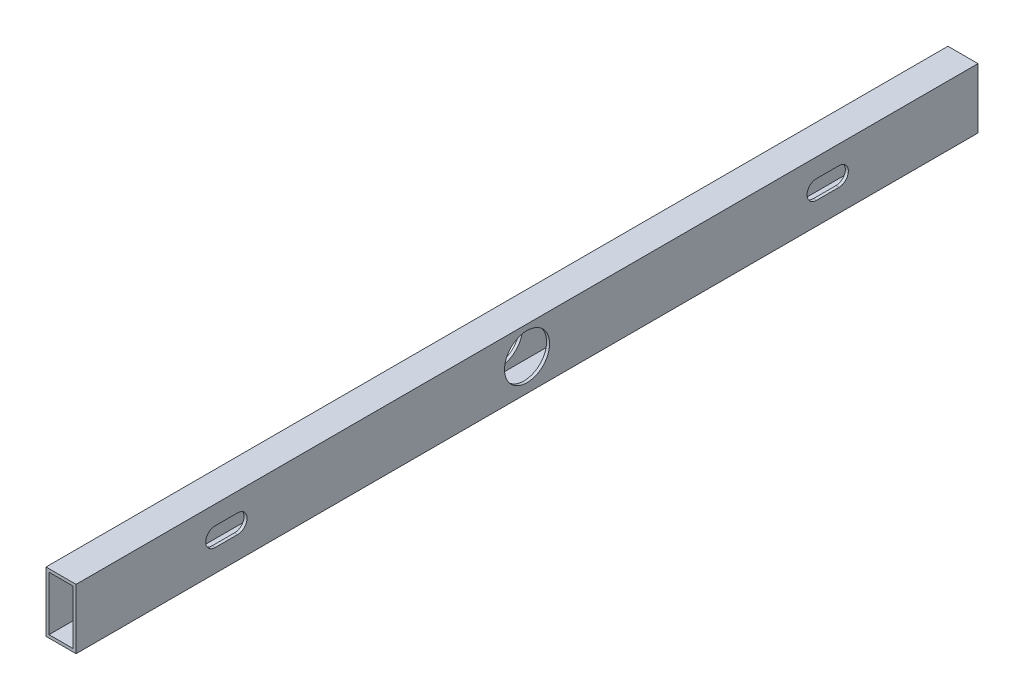
ISO-10303-21;
HEADER;
FILE_DESCRIPTION(('STEP AP214'),'2;1');
FILE_NAME('part.step','',(''),(''),'','','');
FILE_SCHEMA(('AUTOMOTIVE_DESIGN { 1 0 10303 214 1 1 1 1 }'));
ENDSEC;
DATA;
#1=APPLICATION_CONTEXT('core data for automotive mechanical design processes');
#2=APPLICATION_PROTOCOL_DEFINITION('international standard','automotive_design',2000,#1);
#3=PRODUCT_CONTEXT('',#1,'mechanical');
#4=PRODUCT('Part','Part','',(#3));
#5=PRODUCT_RELATED_PRODUCT_CATEGORY('part','',(#4));
#6=PRODUCT_DEFINITION_FORMATION('','',#4);
#7=PRODUCT_DEFINITION_CONTEXT('part definition',#1,'design');
#8=PRODUCT_DEFINITION('design','',#6,#7);
#9=PRODUCT_DEFINITION_SHAPE('','',#8);
#10=(LENGTH_UNIT() NAMED_UNIT(*) SI_UNIT(.MILLI.,.METRE.));
#11=(NAMED_UNIT(*) PLANE_ANGLE_UNIT() SI_UNIT($,.RADIAN.));
#12=(NAMED_UNIT(*) SI_UNIT($,.STERADIAN.) SOLID_ANGLE_UNIT());
#13=UNCERTAINTY_MEASURE_WITH_UNIT(LENGTH_MEASURE(1.E-05),#10,'distance_accuracy_value','');
#14=(GEOMETRIC_REPRESENTATION_CONTEXT(3) GLOBAL_UNCERTAINTY_ASSIGNED_CONTEXT((#13)) GLOBAL_UNIT_ASSIGNED_CONTEXT((#10,
#11,#12)) REPRESENTATION_CONTEXT('',''));
#15=CARTESIAN_POINT('',(0.,0.,0.));
#16=DIRECTION('',(0.,0.,1.));
#17=DIRECTION('',(1.,0.,0.));
#18=AXIS2_PLACEMENT_3D('',#15,#16,#17);
#19=CARTESIAN_POINT('',(0.,0.,381.));
#20=DIRECTION('',(0.,0.,1.));
#21=DIRECTION('',(1.,0.,0.));
#22=AXIS2_PLACEMENT_3D('',#19,#20,#21);
#23=PLANE('',#22);
#24=DIRECTION('',(0.,1.,0.));
#25=VECTOR('',#24,1.);
#26=CARTESIAN_POINT('',(12.7,-25.4,381.));
#27=LINE('',#26,#25);
#28=CARTESIAN_POINT('',(12.7,-25.4,381.));
#29=VERTEX_POINT('',#28);
#30=CARTESIAN_POINT('',(12.7,25.4,381.));
#31=VERTEX_POINT('',#30);
#32=EDGE_CURVE('E368',#29,#31,#27,.T.);
#33=ORIENTED_EDGE('',*,*,#32,.T.);
#34=DIRECTION('',(-1.,0.,0.));
#35=VECTOR('',#34,1.);
#36=CARTESIAN_POINT('',(-12.7,25.4,381.));
#37=LINE('',#36,#35);
#38=CARTESIAN_POINT('',(-12.7,25.4,381.));
#39=VERTEX_POINT('',#38);
#40=EDGE_CURVE('E371',#31,#39,#37,.T.);
#41=ORIENTED_EDGE('',*,*,#40,.T.);
#42=DIRECTION('',(0.,-1.,0.));
#43=VECTOR('',#42,1.);
#44=CARTESIAN_POINT('',(-12.7,-25.4,381.));
#45=LINE('',#44,#43);
#46=CARTESIAN_POINT('',(-12.7,-25.4,381.));
#47=VERTEX_POINT('',#46);
#48=EDGE_CURVE('E374',#39,#47,#45,.T.);
#49=ORIENTED_EDGE('',*,*,#48,.T.);
#50=DIRECTION('',(1.,0.,0.));
#51=VECTOR('',#50,1.);
#52=CARTESIAN_POINT('',(-12.7,-25.4,381.));
#53=LINE('',#52,#51);
#54=EDGE_CURVE('E376',#47,#29,#53,.T.);
#55=ORIENTED_EDGE('',*,*,#54,.T.);
#56=EDGE_LOOP('',(#33,#41,#49,#55));
#57=FACE_BOUND('',#56,.T.);
#58=DIRECTION('',(-1.,0.,0.));
#59=VECTOR('',#58,1.);
#60=CARTESIAN_POINT('',(0.,22.86,381.));
#61=LINE('',#60,#59);
#62=CARTESIAN_POINT('',(10.16,22.86,381.));
#63=VERTEX_POINT('',#62);
#64=CARTESIAN_POINT('',(-10.16,22.86,381.));
#65=VERTEX_POINT('',#64);
#66=EDGE_CURVE('E339',#63,#65,#61,.T.);
#67=ORIENTED_EDGE('',*,*,#66,.F.);
#68=DIRECTION('',(0.,1.,0.));
#69=VECTOR('',#68,1.);
#70=CARTESIAN_POINT('',(10.16,0.,381.));
#71=LINE('',#70,#69);
#72=CARTESIAN_POINT('',(10.16,-22.86,381.));
#73=VERTEX_POINT('',#72);
#74=EDGE_CURVE('E337',#73,#63,#71,.T.);
#75=ORIENTED_EDGE('',*,*,#74,.F.);
#76=DIRECTION('',(1.,0.,0.));
#77=VECTOR('',#76,1.);
#78=CARTESIAN_POINT('',(0.,-22.86,381.));
#79=LINE('',#78,#77);
#80=CARTESIAN_POINT('',(-10.16,-22.86,381.));
#81=VERTEX_POINT('',#80);
#82=EDGE_CURVE('E345',#81,#73,#79,.T.);
#83=ORIENTED_EDGE('',*,*,#82,.F.);
#84=DIRECTION('',(0.,-1.,0.));
#85=VECTOR('',#84,1.);
#86=CARTESIAN_POINT('',(-10.16,0.,381.));
#87=LINE('',#86,#85);
#88=EDGE_CURVE('E342',#65,#81,#87,.T.);
#89=ORIENTED_EDGE('',*,*,#88,.F.);
#90=EDGE_LOOP('',(#67,#75,#83,#89));
#91=FACE_BOUND('',#90,.T.);
#92=ADVANCED_FACE('F58',(#57,#91),#23,.T.);
#93=CARTESIAN_POINT('',(0.,0.,-381.));
#94=DIRECTION('',(0.,0.,1.));
#95=DIRECTION('',(1.,0.,0.));
#96=AXIS2_PLACEMENT_3D('',#93,#94,#95);
#97=PLANE('',#96);
#98=DIRECTION('',(0.,1.,0.));
#99=VECTOR('',#98,1.);
#100=CARTESIAN_POINT('',(12.7,-25.4,-381.));
#101=LINE('',#100,#99);
#102=CARTESIAN_POINT('',(12.7,-25.4,-381.));
#103=VERTEX_POINT('',#102);
#104=CARTESIAN_POINT('',(12.7,25.4,-381.));
#105=VERTEX_POINT('',#104);
#106=EDGE_CURVE('E367',#103,#105,#101,.T.);
#107=ORIENTED_EDGE('',*,*,#106,.F.);
#108=DIRECTION('',(1.,0.,0.));
#109=VECTOR('',#108,1.);
#110=CARTESIAN_POINT('',(-12.7,-25.4,-381.));
#111=LINE('',#110,#109);
#112=CARTESIAN_POINT('',(-12.7,-25.4,-381.));
#113=VERTEX_POINT('',#112);
#114=EDGE_CURVE('E372',#113,#103,#111,.T.);
#115=ORIENTED_EDGE('',*,*,#114,.F.);
#116=DIRECTION('',(0.,-1.,0.));
#117=VECTOR('',#116,1.);
#118=CARTESIAN_POINT('',(-12.7,-25.4,-381.));
#119=LINE('',#118,#117);
#120=CARTESIAN_POINT('',(-12.7,25.4,-381.));
#121=VERTEX_POINT('',#120);
#122=EDGE_CURVE('E383',#121,#113,#119,.T.);
#123=ORIENTED_EDGE('',*,*,#122,.F.);
#124=DIRECTION('',(-1.,0.,0.));
#125=VECTOR('',#124,1.);
#126=CARTESIAN_POINT('',(-12.7,25.4,-381.));
#127=LINE('',#126,#125);
#128=EDGE_CURVE('E381',#105,#121,#127,.T.);
#129=ORIENTED_EDGE('',*,*,#128,.F.);
#130=EDGE_LOOP('',(#107,#115,#123,#129));
#131=FACE_BOUND('',#130,.T.);
#132=DIRECTION('',(0.,1.,0.));
#133=VECTOR('',#132,1.);
#134=CARTESIAN_POINT('',(10.16,0.,-381.));
#135=LINE('',#134,#133);
#136=CARTESIAN_POINT('',(10.16,-22.86,-381.));
#137=VERTEX_POINT('',#136);
#138=CARTESIAN_POINT('',(10.16,22.86,-381.));
#139=VERTEX_POINT('',#138);
#140=EDGE_CURVE('E336',#137,#139,#135,.T.);
#141=ORIENTED_EDGE('',*,*,#140,.T.);
#142=DIRECTION('',(-1.,0.,0.));
#143=VECTOR('',#142,1.);
#144=CARTESIAN_POINT('',(0.,22.86,-381.));
#145=LINE('',#144,#143);
#146=CARTESIAN_POINT('',(-10.16,22.86,-381.));
#147=VERTEX_POINT('',#146);
#148=EDGE_CURVE('E350',#139,#147,#145,.T.);
#149=ORIENTED_EDGE('',*,*,#148,.T.);
#150=DIRECTION('',(0.,-1.,0.));
#151=VECTOR('',#150,1.);
#152=CARTESIAN_POINT('',(-10.16,0.,-381.));
#153=LINE('',#152,#151);
#154=CARTESIAN_POINT('',(-10.16,-22.86,-381.));
#155=VERTEX_POINT('',#154);
#156=EDGE_CURVE('E353',#147,#155,#153,.T.);
#157=ORIENTED_EDGE('',*,*,#156,.T.);
#158=DIRECTION('',(1.,0.,0.));
#159=VECTOR('',#158,1.);
#160=CARTESIAN_POINT('',(0.,-22.86,-381.));
#161=LINE('',#160,#159);
#162=EDGE_CURVE('E340',#155,#137,#161,.T.);
#163=ORIENTED_EDGE('',*,*,#162,.T.);
#164=EDGE_LOOP('',(#141,#149,#157,#163));
#165=FACE_BOUND('',#164,.T.);
#166=ADVANCED_FACE('F442',(#131,#165),#97,.F.);
#167=CARTESIAN_POINT('',(12.7,-25.4,381.));
#168=DIRECTION('',(-1.,0.,0.));
#169=DIRECTION('',(0.,0.,1.));
#170=AXIS2_PLACEMENT_3D('',#167,#168,#169);
#171=PLANE('',#170);
#172=DIRECTION('',(0.,0.,1.));
#173=VECTOR('',#172,1.);
#174=CARTESIAN_POINT('',(12.7,9.46150000000008,244.475));
#175=LINE('',#174,#173);
#176=CARTESIAN_POINT('',(12.7,9.46150000000009,244.475));
#177=VERTEX_POINT('',#176);
#178=CARTESIAN_POINT('',(12.7,9.46150000000008,263.525));
#179=VERTEX_POINT('',#178);
#180=EDGE_CURVE('E288',#177,#179,#175,.T.);
#181=ORIENTED_EDGE('',*,*,#180,.F.);
#182=CARTESIAN_POINT('',(12.7,1.52399999999994,244.475));
#183=DIRECTION('',(1.,0.,0.));
#184=DIRECTION('',(0.,0.,1.));
#185=AXIS2_PLACEMENT_3D('',#182,#183,#184);
#186=CIRCLE('',#185,7.93750000000007);
#187=CARTESIAN_POINT('',(12.7,-6.41350000000006,244.475));
#188=VERTEX_POINT('',#187);
#189=EDGE_CURVE('E73',#188,#177,#186,.T.);
#190=ORIENTED_EDGE('',*,*,#189,.F.);
#191=DIRECTION('',(0.,0.,-1.));
#192=VECTOR('',#191,1.);
#193=CARTESIAN_POINT('',(12.7,-6.41350000000006,244.475));
#194=LINE('',#193,#192);
#195=CARTESIAN_POINT('',(12.7,-6.41350000000013,263.525));
#196=VERTEX_POINT('',#195);
#197=EDGE_CURVE('E277',#196,#188,#194,.T.);
#198=ORIENTED_EDGE('',*,*,#197,.F.);
#199=CARTESIAN_POINT('',(12.7,1.52399999999994,263.525));
#200=DIRECTION('',(1.,0.,0.));
#201=DIRECTION('',(0.,0.,1.));
#202=AXIS2_PLACEMENT_3D('',#199,#200,#201);
#203=CIRCLE('',#202,7.93750000000007);
#204=EDGE_CURVE('E291',#179,#196,#203,.T.);
#205=ORIENTED_EDGE('',*,*,#204,.F.);
#206=EDGE_LOOP('',(#181,#190,#198,#205));
#207=FACE_BOUND('',#206,.T.);
#208=DIRECTION('',(0.,0.,-1.));
#209=VECTOR('',#208,1.);
#210=CARTESIAN_POINT('',(12.7,-6.4135,-244.475));
#211=LINE('',#210,#209);
#212=CARTESIAN_POINT('',(12.7,-6.4135,-244.475));
#213=VERTEX_POINT('',#212);
#214=CARTESIAN_POINT('',(12.7,-6.41350000000006,-263.525));
#215=VERTEX_POINT('',#214);
#216=EDGE_CURVE('E258',#213,#215,#211,.T.);
#217=ORIENTED_EDGE('',*,*,#216,.F.);
#218=CARTESIAN_POINT('',(12.7,1.524,-244.475));
#219=DIRECTION('',(1.,0.,0.));
#220=DIRECTION('',(0.,0.,-1.));
#221=AXIS2_PLACEMENT_3D('',#218,#219,#220);
#222=CIRCLE('',#221,7.93750000000007);
#223=CARTESIAN_POINT('',(12.7,9.46150000000014,-244.475));
#224=VERTEX_POINT('',#223);
#225=EDGE_CURVE('E81',#224,#213,#222,.T.);
#226=ORIENTED_EDGE('',*,*,#225,.F.);
#227=DIRECTION('',(0.,0.,1.));
#228=VECTOR('',#227,1.);
#229=CARTESIAN_POINT('',(12.7,9.46150000000014,-244.475));
#230=LINE('',#229,#228);
#231=CARTESIAN_POINT('',(12.7,9.46150000000015,-263.525));
#232=VERTEX_POINT('',#231);
#233=EDGE_CURVE('E249',#232,#224,#230,.T.);
#234=ORIENTED_EDGE('',*,*,#233,.F.);
#235=CARTESIAN_POINT('',(12.7,1.52400000000001,-263.525));
#236=DIRECTION('',(1.,0.,0.));
#237=DIRECTION('',(0.,0.,-1.));
#238=AXIS2_PLACEMENT_3D('',#235,#236,#237);
#239=CIRCLE('',#238,7.93750000000007);
#240=EDGE_CURVE('E252',#215,#232,#239,.T.);
#241=ORIENTED_EDGE('',*,*,#240,.F.);
#242=EDGE_LOOP('',(#217,#226,#234,#241));
#243=FACE_BOUND('',#242,.T.);
#244=CARTESIAN_POINT('',(12.7,1.524,0.));
#245=DIRECTION('',(1.,0.,0.));
#246=DIRECTION('',(0.,0.,-1.));
#247=AXIS2_PLACEMENT_3D('',#244,#245,#246);
#248=CIRCLE('',#247,19.05);
#249=CARTESIAN_POINT('',(12.7,1.524,-19.05));
#250=VERTEX_POINT('',#249);
#251=EDGE_CURVE('E266',#250,#250,#248,.T.);
#252=ORIENTED_EDGE('',*,*,#251,.F.);
#253=EDGE_LOOP('',(#252));
#254=FACE_BOUND('',#253,.T.);
#255=ORIENTED_EDGE('',*,*,#106,.T.);
#256=DIRECTION('',(0.,0.,-1.));
#257=VECTOR('',#256,1.);
#258=CARTESIAN_POINT('',(12.7,25.4,381.));
#259=LINE('',#258,#257);
#260=EDGE_CURVE('E394',#31,#105,#259,.T.);
#261=ORIENTED_EDGE('',*,*,#260,.F.);
#262=ORIENTED_EDGE('',*,*,#32,.F.);
#263=DIRECTION('',(0.,0.,-1.));
#264=VECTOR('',#263,1.);
#265=CARTESIAN_POINT('',(12.7,-25.4,381.));
#266=LINE('',#265,#264);
#267=EDGE_CURVE('E378',#29,#103,#266,.T.);
#268=ORIENTED_EDGE('',*,*,#267,.T.);
#269=EDGE_LOOP('',(#255,#261,#262,#268));
#270=FACE_BOUND('',#269,.T.);
#271=ADVANCED_FACE('F60',(#207,#243,#254,#270),#171,.F.);
#272=CARTESIAN_POINT('',(-12.7,25.4,381.));
#273=DIRECTION('',(0.,-1.,0.));
#274=DIRECTION('',(0.,0.,-1.));
#275=AXIS2_PLACEMENT_3D('',#272,#273,#274);
#276=PLANE('',#275);
#277=ORIENTED_EDGE('',*,*,#128,.T.);
#278=DIRECTION('',(0.,0.,-1.));
#279=VECTOR('',#278,1.);
#280=CARTESIAN_POINT('',(-12.7,25.4,381.));
#281=LINE('',#280,#279);
#282=EDGE_CURVE('E391',#39,#121,#281,.T.);
#283=ORIENTED_EDGE('',*,*,#282,.F.);
#284=ORIENTED_EDGE('',*,*,#40,.F.);
#285=ORIENTED_EDGE('',*,*,#260,.T.);
#286=EDGE_LOOP('',(#277,#283,#284,#285));
#287=FACE_BOUND('',#286,.T.);
#288=ADVANCED_FACE('F431',(#287),#276,.F.);
#289=CARTESIAN_POINT('',(-12.7,-25.4,381.));
#290=DIRECTION('',(1.,0.,0.));
#291=DIRECTION('',(0.,0.,-1.));
#292=AXIS2_PLACEMENT_3D('',#289,#290,#291);
#293=PLANE('',#292);
#294=DIRECTION('',(0.,0.,-1.));
#295=VECTOR('',#294,1.);
#296=CARTESIAN_POINT('',(-12.7,-6.41350000000006,244.475));
#297=LINE('',#296,#295);
#298=CARTESIAN_POINT('',(-12.7,-6.41350000000013,263.525));
#299=VERTEX_POINT('',#298);
#300=CARTESIAN_POINT('',(-12.7,-6.41350000000006,244.475));
#301=VERTEX_POINT('',#300);
#302=EDGE_CURVE('E283',#299,#301,#297,.T.);
#303=ORIENTED_EDGE('',*,*,#302,.T.);
#304=CARTESIAN_POINT('',(-12.7,1.52399999999994,244.475));
#305=DIRECTION('',(1.,0.,0.));
#306=DIRECTION('',(0.,0.,1.));
#307=AXIS2_PLACEMENT_3D('',#304,#305,#306);
#308=CIRCLE('',#307,7.93750000000007);
#309=CARTESIAN_POINT('',(-12.7,9.46150000000008,244.475));
#310=VERTEX_POINT('',#309);
#311=EDGE_CURVE('E273',#301,#310,#308,.T.);
#312=ORIENTED_EDGE('',*,*,#311,.T.);
#313=DIRECTION('',(0.,0.,1.));
#314=VECTOR('',#313,1.);
#315=CARTESIAN_POINT('',(-12.7,9.46150000000008,244.475));
#316=LINE('',#315,#314);
#317=CARTESIAN_POINT('',(-12.7,9.46150000000009,263.525));
#318=VERTEX_POINT('',#317);
#319=EDGE_CURVE('E276',#310,#318,#316,.T.);
#320=ORIENTED_EDGE('',*,*,#319,.T.);
#321=CARTESIAN_POINT('',(-12.7,1.52399999999994,263.525));
#322=DIRECTION('',(1.,0.,0.));
#323=DIRECTION('',(0.,0.,1.));
#324=AXIS2_PLACEMENT_3D('',#321,#322,#323);
#325=CIRCLE('',#324,7.93750000000007);
#326=EDGE_CURVE('E280',#318,#299,#325,.T.);
#327=ORIENTED_EDGE('',*,*,#326,.T.);
#328=EDGE_LOOP('',(#303,#312,#320,#327));
#329=FACE_BOUND('',#328,.T.);
#330=DIRECTION('',(0.,0.,1.));
#331=VECTOR('',#330,1.);
#332=CARTESIAN_POINT('',(-12.7,9.46150000000014,-244.475));
#333=LINE('',#332,#331);
#334=CARTESIAN_POINT('',(-12.7,9.46150000000015,-263.525));
#335=VERTEX_POINT('',#334);
#336=CARTESIAN_POINT('',(-12.7,9.46150000000014,-244.475));
#337=VERTEX_POINT('',#336);
#338=EDGE_CURVE('E248',#335,#337,#333,.T.);
#339=ORIENTED_EDGE('',*,*,#338,.T.);
#340=CARTESIAN_POINT('',(-12.7,1.524,-244.475));
#341=DIRECTION('',(1.,0.,0.));
#342=DIRECTION('',(0.,0.,-1.));
#343=AXIS2_PLACEMENT_3D('',#340,#341,#342);
#344=CIRCLE('',#343,7.93750000000007);
#345=CARTESIAN_POINT('',(-12.7,-6.4135,-244.475));
#346=VERTEX_POINT('',#345);
#347=EDGE_CURVE('E226',#337,#346,#344,.T.);
#348=ORIENTED_EDGE('',*,*,#347,.T.);
#349=DIRECTION('',(0.,0.,-1.));
#350=VECTOR('',#349,1.);
#351=CARTESIAN_POINT('',(-12.7,-6.4135,-244.475));
#352=LINE('',#351,#350);
#353=CARTESIAN_POINT('',(-12.7,-6.41349999999999,-263.525));
#354=VERTEX_POINT('',#353);
#355=EDGE_CURVE('E237',#346,#354,#352,.T.);
#356=ORIENTED_EDGE('',*,*,#355,.T.);
#357=CARTESIAN_POINT('',(-12.7,1.52400000000001,-263.525));
#358=DIRECTION('',(1.,0.,0.));
#359=DIRECTION('',(0.,0.,-1.));
#360=AXIS2_PLACEMENT_3D('',#357,#358,#359);
#361=CIRCLE('',#360,7.93750000000007);
#362=EDGE_CURVE('E243',#354,#335,#361,.T.);
#363=ORIENTED_EDGE('',*,*,#362,.T.);
#364=EDGE_LOOP('',(#339,#348,#356,#363));
#365=FACE_BOUND('',#364,.T.);
#366=CARTESIAN_POINT('',(-12.7,1.524,0.));
#367=DIRECTION('',(1.,0.,0.));
#368=DIRECTION('',(0.,0.,-1.));
#369=AXIS2_PLACEMENT_3D('',#366,#367,#368);
#370=CIRCLE('',#369,19.05);
#371=CARTESIAN_POINT('',(-12.7,1.524,-19.05));
#372=VERTEX_POINT('',#371);
#373=EDGE_CURVE('E309',#372,#372,#370,.T.);
#374=ORIENTED_EDGE('',*,*,#373,.T.);
#375=EDGE_LOOP('',(#374));
#376=FACE_BOUND('',#375,.T.);
#377=ORIENTED_EDGE('',*,*,#122,.T.);
#378=DIRECTION('',(0.,0.,-1.));
#379=VECTOR('',#378,1.);
#380=CARTESIAN_POINT('',(-12.7,-25.4,381.));
#381=LINE('',#380,#379);
#382=EDGE_CURVE('E388',#47,#113,#381,.T.);
#383=ORIENTED_EDGE('',*,*,#382,.F.);
#384=ORIENTED_EDGE('',*,*,#48,.F.);
#385=ORIENTED_EDGE('',*,*,#282,.T.);
#386=EDGE_LOOP('',(#377,#383,#384,#385));
#387=FACE_BOUND('',#386,.T.);
#388=ADVANCED_FACE('F245',(#329,#365,#376,#387),#293,.F.);
#389=CARTESIAN_POINT('',(-12.7,-25.4,381.));
#390=DIRECTION('',(0.,1.,0.));
#391=DIRECTION('',(0.,0.,1.));
#392=AXIS2_PLACEMENT_3D('',#389,#390,#391);
#393=PLANE('',#392);
#394=ORIENTED_EDGE('',*,*,#114,.T.);
#395=ORIENTED_EDGE('',*,*,#267,.F.);
#396=ORIENTED_EDGE('',*,*,#54,.F.);
#397=ORIENTED_EDGE('',*,*,#382,.T.);
#398=EDGE_LOOP('',(#394,#395,#396,#397));
#399=FACE_BOUND('',#398,.T.);
#400=ADVANCED_FACE('F430',(#399),#393,.F.);
#401=CARTESIAN_POINT('',(10.16,0.,381.));
#402=DIRECTION('',(-1.,0.,0.));
#403=DIRECTION('',(0.,0.,1.));
#404=AXIS2_PLACEMENT_3D('',#401,#402,#403);
#405=PLANE('',#404);
#406=CARTESIAN_POINT('',(10.16,1.52399999999994,244.475));
#407=DIRECTION('',(-1.,0.,0.));
#408=DIRECTION('',(0.,0.,1.));
#409=AXIS2_PLACEMENT_3D('',#406,#407,#408);
#410=CIRCLE('',#409,7.93750000000007);
#411=CARTESIAN_POINT('',(10.16,9.46150000000008,244.475));
#412=VERTEX_POINT('',#411);
#413=CARTESIAN_POINT('',(10.16,-6.41350000000006,244.475));
#414=VERTEX_POINT('',#413);
#415=EDGE_CURVE('E334',#412,#414,#410,.T.);
#416=ORIENTED_EDGE('',*,*,#415,.F.);
#417=DIRECTION('',(0.,0.,-1.));
#418=VECTOR('',#417,1.);
#419=CARTESIAN_POINT('',(10.16,9.46150000000008,381.));
#420=LINE('',#419,#418);
#421=CARTESIAN_POINT('',(10.16,9.46150000000008,263.525));
#422=VERTEX_POINT('',#421);
#423=EDGE_CURVE('E327',#422,#412,#420,.T.);
#424=ORIENTED_EDGE('',*,*,#423,.F.);
#425=CARTESIAN_POINT('',(10.16,1.52399999999994,263.525));
#426=DIRECTION('',(-1.,0.,0.));
#427=DIRECTION('',(0.,0.,1.));
#428=AXIS2_PLACEMENT_3D('',#425,#426,#427);
#429=CIRCLE('',#428,7.93750000000007);
#430=CARTESIAN_POINT('',(10.16,-6.41350000000013,263.525));
#431=VERTEX_POINT('',#430);
#432=EDGE_CURVE('E329',#431,#422,#429,.T.);
#433=ORIENTED_EDGE('',*,*,#432,.F.);
#434=DIRECTION('',(0.,0.,1.));
#435=VECTOR('',#434,1.);
#436=CARTESIAN_POINT('',(10.16,-6.41350000000006,381.));
#437=LINE('',#436,#435);
#438=EDGE_CURVE('E332',#414,#431,#437,.T.);
#439=ORIENTED_EDGE('',*,*,#438,.F.);
#440=EDGE_LOOP('',(#416,#424,#433,#439));
#441=FACE_BOUND('',#440,.T.);
#442=CARTESIAN_POINT('',(10.16,1.524,-244.475));
#443=DIRECTION('',(-1.,0.,0.));
#444=DIRECTION('',(0.,0.,1.));
#445=AXIS2_PLACEMENT_3D('',#442,#443,#444);
#446=CIRCLE('',#445,7.93750000000007);
#447=CARTESIAN_POINT('',(10.16,-6.4135,-244.475));
#448=VERTEX_POINT('',#447);
#449=CARTESIAN_POINT('',(10.16,9.46150000000014,-244.475));
#450=VERTEX_POINT('',#449);
#451=EDGE_CURVE('E325',#448,#450,#446,.T.);
#452=ORIENTED_EDGE('',*,*,#451,.F.);
#453=DIRECTION('',(0.,0.,1.));
#454=VECTOR('',#453,1.);
#455=CARTESIAN_POINT('',(10.16,-6.41350000000011,381.));
#456=LINE('',#455,#454);
#457=CARTESIAN_POINT('',(10.16,-6.41349999999999,-263.525));
#458=VERTEX_POINT('',#457);
#459=EDGE_CURVE('E318',#458,#448,#456,.T.);
#460=ORIENTED_EDGE('',*,*,#459,.F.);
#461=CARTESIAN_POINT('',(10.16,1.52400000000001,-263.525));
#462=DIRECTION('',(-1.,0.,0.));
#463=DIRECTION('',(0.,0.,1.));
#464=AXIS2_PLACEMENT_3D('',#461,#462,#463);
#465=CIRCLE('',#464,7.93750000000007);
#466=CARTESIAN_POINT('',(10.16,9.46150000000015,-263.525));
#467=VERTEX_POINT('',#466);
#468=EDGE_CURVE('E320',#467,#458,#465,.T.);
#469=ORIENTED_EDGE('',*,*,#468,.F.);
#470=DIRECTION('',(0.,0.,-1.));
#471=VECTOR('',#470,1.);
#472=CARTESIAN_POINT('',(10.16,9.46150000000003,381.));
#473=LINE('',#472,#471);
#474=EDGE_CURVE('E323',#450,#467,#473,.T.);
#475=ORIENTED_EDGE('',*,*,#474,.F.);
#476=EDGE_LOOP('',(#452,#460,#469,#475));
#477=FACE_BOUND('',#476,.T.);
#478=CARTESIAN_POINT('',(10.16,1.524,0.));
#479=DIRECTION('',(-1.,0.,0.));
#480=DIRECTION('',(0.,0.,1.));
#481=AXIS2_PLACEMENT_3D('',#478,#479,#480);
#482=CIRCLE('',#481,19.05);
#483=CARTESIAN_POINT('',(10.16,1.524,19.05));
#484=VERTEX_POINT('',#483);
#485=EDGE_CURVE('E315',#484,#484,#482,.T.);
#486=ORIENTED_EDGE('',*,*,#485,.F.);
#487=EDGE_LOOP('',(#486));
#488=FACE_BOUND('',#487,.T.);
#489=ORIENTED_EDGE('',*,*,#140,.F.);
#490=DIRECTION('',(0.,0.,-1.));
#491=VECTOR('',#490,1.);
#492=CARTESIAN_POINT('',(10.16,-22.86,381.));
#493=LINE('',#492,#491);
#494=EDGE_CURVE('E347',#73,#137,#493,.T.);
#495=ORIENTED_EDGE('',*,*,#494,.F.);
#496=ORIENTED_EDGE('',*,*,#74,.T.);
#497=DIRECTION('',(0.,0.,-1.));
#498=VECTOR('',#497,1.);
#499=CARTESIAN_POINT('',(10.16,22.86,381.));
#500=LINE('',#499,#498);
#501=EDGE_CURVE('E364',#63,#139,#500,.T.);
#502=ORIENTED_EDGE('',*,*,#501,.T.);
#503=EDGE_LOOP('',(#489,#495,#496,#502));
#504=FACE_BOUND('',#503,.T.);
#505=ADVANCED_FACE('F437',(#441,#477,#488,#504),#405,.T.);
#506=CARTESIAN_POINT('',(0.,22.86,381.));
#507=DIRECTION('',(0.,-1.,0.));
#508=DIRECTION('',(0.,0.,-1.));
#509=AXIS2_PLACEMENT_3D('',#506,#507,#508);
#510=PLANE('',#509);
#511=ORIENTED_EDGE('',*,*,#148,.F.);
#512=ORIENTED_EDGE('',*,*,#501,.F.);
#513=ORIENTED_EDGE('',*,*,#66,.T.);
#514=DIRECTION('',(0.,0.,-1.));
#515=VECTOR('',#514,1.);
#516=CARTESIAN_POINT('',(-10.16,22.86,381.));
#517=LINE('',#516,#515);
#518=EDGE_CURVE('E362',#65,#147,#517,.T.);
#519=ORIENTED_EDGE('',*,*,#518,.T.);
#520=EDGE_LOOP('',(#511,#512,#513,#519));
#521=FACE_BOUND('',#520,.T.);
#522=ADVANCED_FACE('F454',(#521),#510,.T.);
#523=CARTESIAN_POINT('',(-10.16,0.,381.));
#524=DIRECTION('',(1.,0.,0.));
#525=DIRECTION('',(0.,0.,-1.));
#526=AXIS2_PLACEMENT_3D('',#523,#524,#525);
#527=PLANE('',#526);
#528=CARTESIAN_POINT('',(-10.16,1.52399999999994,244.475));
#529=DIRECTION('',(1.,0.,0.));
#530=DIRECTION('',(0.,0.,-1.));
#531=AXIS2_PLACEMENT_3D('',#528,#529,#530);
#532=CIRCLE('',#531,7.93750000000007);
#533=CARTESIAN_POINT('',(-10.16,-6.41350000000006,244.475));
#534=VERTEX_POINT('',#533);
#535=CARTESIAN_POINT('',(-10.16,9.46150000000008,244.475));
#536=VERTEX_POINT('',#535);
#537=EDGE_CURVE('E12',#534,#536,#532,.T.);
#538=ORIENTED_EDGE('',*,*,#537,.F.);
#539=DIRECTION('',(0.,0.,-1.));
#540=VECTOR('',#539,1.);
#541=CARTESIAN_POINT('',(-10.16,-6.41350000000006,381.));
#542=LINE('',#541,#540);
#543=CARTESIAN_POINT('',(-10.16,-6.41350000000013,263.525));
#544=VERTEX_POINT('',#543);
#545=EDGE_CURVE('E66',#544,#534,#542,.T.);
#546=ORIENTED_EDGE('',*,*,#545,.F.);
#547=CARTESIAN_POINT('',(-10.16,1.52399999999994,263.525));
#548=DIRECTION('',(1.,0.,0.));
#549=DIRECTION('',(0.,0.,-1.));
#550=AXIS2_PLACEMENT_3D('',#547,#548,#549);
#551=CIRCLE('',#550,7.93750000000007);
#552=CARTESIAN_POINT('',(-10.16,9.46150000000008,263.525));
#553=VERTEX_POINT('',#552);
#554=EDGE_CURVE('E408',#553,#544,#551,.T.);
#555=ORIENTED_EDGE('',*,*,#554,.F.);
#556=DIRECTION('',(0.,0.,1.));
#557=VECTOR('',#556,1.);
#558=CARTESIAN_POINT('',(-10.16,9.46150000000008,381.));
#559=LINE('',#558,#557);
#560=EDGE_CURVE('E406',#536,#553,#559,.T.);
#561=ORIENTED_EDGE('',*,*,#560,.F.);
#562=EDGE_LOOP('',(#538,#546,#555,#561));
#563=FACE_BOUND('',#562,.T.);
#564=CARTESIAN_POINT('',(-10.16,1.524,-244.475));
#565=DIRECTION('',(1.,0.,0.));
#566=DIRECTION('',(0.,0.,-1.));
#567=AXIS2_PLACEMENT_3D('',#564,#565,#566);
#568=CIRCLE('',#567,7.93750000000007);
#569=CARTESIAN_POINT('',(-10.16,9.46150000000014,-244.475));
#570=VERTEX_POINT('',#569);
#571=CARTESIAN_POINT('',(-10.16,-6.4135,-244.475));
#572=VERTEX_POINT('',#571);
#573=EDGE_CURVE('E229',#570,#572,#568,.T.);
#574=ORIENTED_EDGE('',*,*,#573,.F.);
#575=DIRECTION('',(0.,0.,1.));
#576=VECTOR('',#575,1.);
#577=CARTESIAN_POINT('',(-10.16,9.46150000000003,381.));
#578=LINE('',#577,#576);
#579=CARTESIAN_POINT('',(-10.16,9.46150000000015,-263.525));
#580=VERTEX_POINT('',#579);
#581=EDGE_CURVE('E403',#580,#570,#578,.T.);
#582=ORIENTED_EDGE('',*,*,#581,.F.);
#583=CARTESIAN_POINT('',(-10.16,1.52400000000001,-263.525));
#584=DIRECTION('',(1.,0.,0.));
#585=DIRECTION('',(0.,0.,-1.));
#586=AXIS2_PLACEMENT_3D('',#583,#584,#585);
#587=CIRCLE('',#586,7.93750000000007);
#588=CARTESIAN_POINT('',(-10.16,-6.41350000000006,-263.525));
#589=VERTEX_POINT('',#588);
#590=EDGE_CURVE('E401',#589,#580,#587,.T.);
#591=ORIENTED_EDGE('',*,*,#590,.F.);
#592=DIRECTION('',(0.,0.,-1.));
#593=VECTOR('',#592,1.);
#594=CARTESIAN_POINT('',(-10.16,-6.41350000000011,381.));
#595=LINE('',#594,#593);
#596=EDGE_CURVE('E397',#572,#589,#595,.T.);
#597=ORIENTED_EDGE('',*,*,#596,.F.);
#598=EDGE_LOOP('',(#574,#582,#591,#597));
#599=FACE_BOUND('',#598,.T.);
#600=CARTESIAN_POINT('',(-10.16,1.524,0.));
#601=DIRECTION('',(1.,0.,0.));
#602=DIRECTION('',(0.,0.,-1.));
#603=AXIS2_PLACEMENT_3D('',#600,#601,#602);
#604=CIRCLE('',#603,19.05);
#605=CARTESIAN_POINT('',(-10.16,1.524,-19.05));
#606=VERTEX_POINT('',#605);
#607=EDGE_CURVE('E312',#606,#606,#604,.T.);
#608=ORIENTED_EDGE('',*,*,#607,.F.);
#609=EDGE_LOOP('',(#608));
#610=FACE_BOUND('',#609,.T.);
#611=ORIENTED_EDGE('',*,*,#156,.F.);
#612=ORIENTED_EDGE('',*,*,#518,.F.);
#613=ORIENTED_EDGE('',*,*,#88,.T.);
#614=DIRECTION('',(0.,0.,-1.));
#615=VECTOR('',#614,1.);
#616=CARTESIAN_POINT('',(-10.16,-22.86,381.));
#617=LINE('',#616,#615);
#618=EDGE_CURVE('E360',#81,#155,#617,.T.);
#619=ORIENTED_EDGE('',*,*,#618,.T.);
#620=EDGE_LOOP('',(#611,#612,#613,#619));
#621=FACE_BOUND('',#620,.T.);
#622=ADVANCED_FACE('F420',(#563,#599,#610,#621),#527,.T.);
#623=CARTESIAN_POINT('',(0.,-22.86,381.));
#624=DIRECTION('',(0.,1.,0.));
#625=DIRECTION('',(0.,0.,1.));
#626=AXIS2_PLACEMENT_3D('',#623,#624,#625);
#627=PLANE('',#626);
#628=ORIENTED_EDGE('',*,*,#162,.F.);
#629=ORIENTED_EDGE('',*,*,#618,.F.);
#630=ORIENTED_EDGE('',*,*,#82,.T.);
#631=ORIENTED_EDGE('',*,*,#494,.T.);
#632=EDGE_LOOP('',(#628,#629,#630,#631));
#633=FACE_BOUND('',#632,.T.);
#634=ADVANCED_FACE('F461',(#633),#627,.T.);
#635=CARTESIAN_POINT('',(-12.7,1.524,0.));
#636=DIRECTION('',(1.,0.,0.));
#637=DIRECTION('',(0.,0.,-1.));
#638=AXIS2_PLACEMENT_3D('',#635,#636,#637);
#639=CYLINDRICAL_SURFACE('',#638,19.05);
#640=ORIENTED_EDGE('',*,*,#607,.T.);
#641=EDGE_LOOP('',(#640));
#642=FACE_BOUND('',#641,.T.);
#643=ORIENTED_EDGE('',*,*,#373,.F.);
#644=EDGE_LOOP('',(#643));
#645=FACE_BOUND('',#644,.T.);
#646=ADVANCED_FACE('F464',(#642,#645),#639,.F.);
#647=CARTESIAN_POINT('',(-12.7,-6.4135,-244.475));
#648=DIRECTION('',(0.,-1.,0.));
#649=DIRECTION('',(0.,0.,-1.));
#650=AXIS2_PLACEMENT_3D('',#647,#648,#649);
#651=PLANE('',#650);
#652=ORIENTED_EDGE('',*,*,#596,.T.);
#653=DIRECTION('',(1.,0.,0.));
#654=VECTOR('',#653,1.);
#655=CARTESIAN_POINT('',(-12.7,-6.41350000000006,-263.525));
#656=LINE('',#655,#654);
#657=EDGE_CURVE('E240',#354,#589,#656,.T.);
#658=ORIENTED_EDGE('',*,*,#657,.F.);
#659=ORIENTED_EDGE('',*,*,#355,.F.);
#660=DIRECTION('',(1.,0.,0.));
#661=VECTOR('',#660,1.);
#662=CARTESIAN_POINT('',(-12.7,-6.4135,-244.475));
#663=LINE('',#662,#661);
#664=EDGE_CURVE('E221',#346,#572,#663,.T.);
#665=ORIENTED_EDGE('',*,*,#664,.T.);
#666=EDGE_LOOP('',(#652,#658,#659,#665));
#667=FACE_BOUND('',#666,.T.);
#668=ADVANCED_FACE('F238',(#667),#651,.F.);
#669=CARTESIAN_POINT('',(-12.7,1.52400000000001,-263.525));
#670=DIRECTION('',(1.,0.,0.));
#671=DIRECTION('',(0.,0.,-1.));
#672=AXIS2_PLACEMENT_3D('',#669,#670,#671);
#673=CYLINDRICAL_SURFACE('',#672,7.93750000000007);
#674=ORIENTED_EDGE('',*,*,#590,.T.);
#675=DIRECTION('',(1.,0.,0.));
#676=VECTOR('',#675,1.);
#677=CARTESIAN_POINT('',(-12.7,9.46150000000015,-263.525));
#678=LINE('',#677,#676);
#679=EDGE_CURVE('E268',#335,#580,#678,.T.);
#680=ORIENTED_EDGE('',*,*,#679,.F.);
#681=ORIENTED_EDGE('',*,*,#362,.F.);
#682=ORIENTED_EDGE('',*,*,#657,.T.);
#683=EDGE_LOOP('',(#674,#680,#681,#682));
#684=FACE_BOUND('',#683,.T.);
#685=ADVANCED_FACE('F488',(#684),#673,.F.);
#686=CARTESIAN_POINT('',(-12.7,9.46150000000014,-244.475));
#687=DIRECTION('',(0.,1.,0.));
#688=DIRECTION('',(0.,0.,1.));
#689=AXIS2_PLACEMENT_3D('',#686,#687,#688);
#690=PLANE('',#689);
#691=ORIENTED_EDGE('',*,*,#581,.T.);
#692=DIRECTION('',(1.,0.,0.));
#693=VECTOR('',#692,1.);
#694=CARTESIAN_POINT('',(-12.7,9.46150000000014,-244.475));
#695=LINE('',#694,#693);
#696=EDGE_CURVE('E264',#337,#570,#695,.T.);
#697=ORIENTED_EDGE('',*,*,#696,.F.);
#698=ORIENTED_EDGE('',*,*,#338,.F.);
#699=ORIENTED_EDGE('',*,*,#679,.T.);
#700=EDGE_LOOP('',(#691,#697,#698,#699));
#701=FACE_BOUND('',#700,.T.);
#702=ADVANCED_FACE('F484',(#701),#690,.F.);
#703=CARTESIAN_POINT('',(-12.7,1.524,-244.475));
#704=DIRECTION('',(1.,0.,0.));
#705=DIRECTION('',(0.,0.,-1.));
#706=AXIS2_PLACEMENT_3D('',#703,#704,#705);
#707=CYLINDRICAL_SURFACE('',#706,7.93750000000007);
#708=ORIENTED_EDGE('',*,*,#573,.T.);
#709=ORIENTED_EDGE('',*,*,#664,.F.);
#710=ORIENTED_EDGE('',*,*,#347,.F.);
#711=ORIENTED_EDGE('',*,*,#696,.T.);
#712=EDGE_LOOP('',(#708,#709,#710,#711));
#713=FACE_BOUND('',#712,.T.);
#714=ADVANCED_FACE('F223',(#713),#707,.F.);
#715=CARTESIAN_POINT('',(-12.7,9.46150000000008,244.475));
#716=DIRECTION('',(0.,1.,0.));
#717=DIRECTION('',(0.,0.,1.));
#718=AXIS2_PLACEMENT_3D('',#715,#716,#717);
#719=PLANE('',#718);
#720=ORIENTED_EDGE('',*,*,#560,.T.);
#721=DIRECTION('',(1.,0.,0.));
#722=VECTOR('',#721,1.);
#723=CARTESIAN_POINT('',(-12.7,9.46150000000008,263.525));
#724=LINE('',#723,#722);
#725=EDGE_CURVE('E303',#318,#553,#724,.T.);
#726=ORIENTED_EDGE('',*,*,#725,.F.);
#727=ORIENTED_EDGE('',*,*,#319,.F.);
#728=DIRECTION('',(1.,0.,0.));
#729=VECTOR('',#728,1.);
#730=CARTESIAN_POINT('',(-12.7,9.46150000000008,244.475));
#731=LINE('',#730,#729);
#732=EDGE_CURVE('E307',#310,#536,#731,.T.);
#733=ORIENTED_EDGE('',*,*,#732,.T.);
#734=EDGE_LOOP('',(#720,#726,#727,#733));
#735=FACE_BOUND('',#734,.T.);
#736=ADVANCED_FACE('F424',(#735),#719,.F.);
#737=CARTESIAN_POINT('',(-12.7,1.52399999999994,263.525));
#738=DIRECTION('',(1.,0.,0.));
#739=DIRECTION('',(0.,0.,-1.));
#740=AXIS2_PLACEMENT_3D('',#737,#738,#739);
#741=CYLINDRICAL_SURFACE('',#740,7.93750000000007);
#742=ORIENTED_EDGE('',*,*,#554,.T.);
#743=DIRECTION('',(1.,0.,0.));
#744=VECTOR('',#743,1.);
#745=CARTESIAN_POINT('',(-12.7,-6.41350000000013,263.525));
#746=LINE('',#745,#744);
#747=EDGE_CURVE('E299',#299,#544,#746,.T.);
#748=ORIENTED_EDGE('',*,*,#747,.F.);
#749=ORIENTED_EDGE('',*,*,#326,.F.);
#750=ORIENTED_EDGE('',*,*,#725,.T.);
#751=EDGE_LOOP('',(#742,#748,#749,#750));
#752=FACE_BOUND('',#751,.T.);
#753=ADVANCED_FACE('F427',(#752),#741,.F.);
#754=CARTESIAN_POINT('',(-12.7,-6.41350000000006,244.475));
#755=DIRECTION('',(0.,-1.,0.));
#756=DIRECTION('',(0.,0.,-1.));
#757=AXIS2_PLACEMENT_3D('',#754,#755,#756);
#758=PLANE('',#757);
#759=ORIENTED_EDGE('',*,*,#545,.T.);
#760=DIRECTION('',(1.,0.,0.));
#761=VECTOR('',#760,1.);
#762=CARTESIAN_POINT('',(-12.7,-6.41350000000006,244.475));
#763=LINE('',#762,#761);
#764=EDGE_CURVE('E259',#301,#534,#763,.T.);
#765=ORIENTED_EDGE('',*,*,#764,.F.);
#766=ORIENTED_EDGE('',*,*,#302,.F.);
#767=ORIENTED_EDGE('',*,*,#747,.T.);
#768=EDGE_LOOP('',(#759,#765,#766,#767));
#769=FACE_BOUND('',#768,.T.);
#770=ADVANCED_FACE('F411',(#769),#758,.F.);
#771=CARTESIAN_POINT('',(-12.7,1.52399999999994,244.475));
#772=DIRECTION('',(1.,0.,0.));
#773=DIRECTION('',(0.,0.,-1.));
#774=AXIS2_PLACEMENT_3D('',#771,#772,#773);
#775=CYLINDRICAL_SURFACE('',#774,7.93750000000007);
#776=ORIENTED_EDGE('',*,*,#537,.T.);
#777=ORIENTED_EDGE('',*,*,#732,.F.);
#778=ORIENTED_EDGE('',*,*,#311,.F.);
#779=ORIENTED_EDGE('',*,*,#764,.T.);
#780=EDGE_LOOP('',(#776,#777,#778,#779));
#781=FACE_BOUND('',#780,.T.);
#782=ADVANCED_FACE('F418',(#781),#775,.F.);
#783=ORIENTED_EDGE('',*,*,#485,.T.);
#784=EDGE_LOOP('',(#783));
#785=FACE_BOUND('',#784,.T.);
#786=ORIENTED_EDGE('',*,*,#251,.T.);
#787=EDGE_LOOP('',(#786));
#788=FACE_BOUND('',#787,.T.);
#789=ADVANCED_FACE('F469',(#785,#788),#639,.F.);
#790=ORIENTED_EDGE('',*,*,#451,.T.);
#791=EDGE_CURVE('E267',#450,#224,#695,.T.);
#792=ORIENTED_EDGE('',*,*,#791,.T.);
#793=ORIENTED_EDGE('',*,*,#225,.T.);
#794=EDGE_CURVE('E233',#448,#213,#663,.T.);
#795=ORIENTED_EDGE('',*,*,#794,.F.);
#796=EDGE_LOOP('',(#790,#792,#793,#795));
#797=FACE_BOUND('',#796,.T.);
#798=ADVANCED_FACE('F485',(#797),#707,.F.);
#799=ORIENTED_EDGE('',*,*,#474,.T.);
#800=EDGE_CURVE('E271',#467,#232,#678,.T.);
#801=ORIENTED_EDGE('',*,*,#800,.T.);
#802=ORIENTED_EDGE('',*,*,#233,.T.);
#803=ORIENTED_EDGE('',*,*,#791,.F.);
#804=EDGE_LOOP('',(#799,#801,#802,#803));
#805=FACE_BOUND('',#804,.T.);
#806=ADVANCED_FACE('F496',(#805),#690,.F.);
#807=ORIENTED_EDGE('',*,*,#468,.T.);
#808=EDGE_CURVE('E232',#458,#215,#656,.T.);
#809=ORIENTED_EDGE('',*,*,#808,.T.);
#810=ORIENTED_EDGE('',*,*,#240,.T.);
#811=ORIENTED_EDGE('',*,*,#800,.F.);
#812=EDGE_LOOP('',(#807,#809,#810,#811));
#813=FACE_BOUND('',#812,.T.);
#814=ADVANCED_FACE('F493',(#813),#673,.F.);
#815=ORIENTED_EDGE('',*,*,#459,.T.);
#816=ORIENTED_EDGE('',*,*,#794,.T.);
#817=ORIENTED_EDGE('',*,*,#216,.T.);
#818=ORIENTED_EDGE('',*,*,#808,.F.);
#819=EDGE_LOOP('',(#815,#816,#817,#818));
#820=FACE_BOUND('',#819,.T.);
#821=ADVANCED_FACE('F489',(#820),#651,.F.);
#822=ORIENTED_EDGE('',*,*,#415,.T.);
#823=EDGE_CURVE('E298',#414,#188,#763,.T.);
#824=ORIENTED_EDGE('',*,*,#823,.T.);
#825=ORIENTED_EDGE('',*,*,#189,.T.);
#826=EDGE_CURVE('E286',#412,#177,#731,.T.);
#827=ORIENTED_EDGE('',*,*,#826,.F.);
#828=EDGE_LOOP('',(#822,#824,#825,#827));
#829=FACE_BOUND('',#828,.T.);
#830=ADVANCED_FACE('F472',(#829),#775,.F.);
#831=ORIENTED_EDGE('',*,*,#438,.T.);
#832=EDGE_CURVE('E302',#431,#196,#746,.T.);
#833=ORIENTED_EDGE('',*,*,#832,.T.);
#834=ORIENTED_EDGE('',*,*,#197,.T.);
#835=ORIENTED_EDGE('',*,*,#823,.F.);
#836=EDGE_LOOP('',(#831,#833,#834,#835));
#837=FACE_BOUND('',#836,.T.);
#838=ADVANCED_FACE('F481',(#837),#758,.F.);
#839=ORIENTED_EDGE('',*,*,#432,.T.);
#840=EDGE_CURVE('E306',#422,#179,#724,.T.);
#841=ORIENTED_EDGE('',*,*,#840,.T.);
#842=ORIENTED_EDGE('',*,*,#204,.T.);
#843=ORIENTED_EDGE('',*,*,#832,.F.);
#844=EDGE_LOOP('',(#839,#841,#842,#843));
#845=FACE_BOUND('',#844,.T.);
#846=ADVANCED_FACE('F478',(#845),#741,.F.);
#847=ORIENTED_EDGE('',*,*,#423,.T.);
#848=ORIENTED_EDGE('',*,*,#826,.T.);
#849=ORIENTED_EDGE('',*,*,#180,.T.);
#850=ORIENTED_EDGE('',*,*,#840,.F.);
#851=EDGE_LOOP('',(#847,#848,#849,#850));
#852=FACE_BOUND('',#851,.T.);
#853=ADVANCED_FACE('F475',(#852),#719,.F.);
#854=CLOSED_SHELL('',(#92,#166,#271,#288,#388,#400,#505,#522,#622,#634,#646,#668,#685,#702,#714,
#736,#753,#770,#782,#789,#798,#806,#814,#821,#830,#838,#846,#853));
#855=MANIFOLD_SOLID_BREP('B2',#854);
#856=ADVANCED_BREP_SHAPE_REPRESENTATION('',(#18,#855),#14);
#857=SHAPE_DEFINITION_REPRESENTATION(#9,#856);
ENDSEC;
END-ISO-10303-21;
